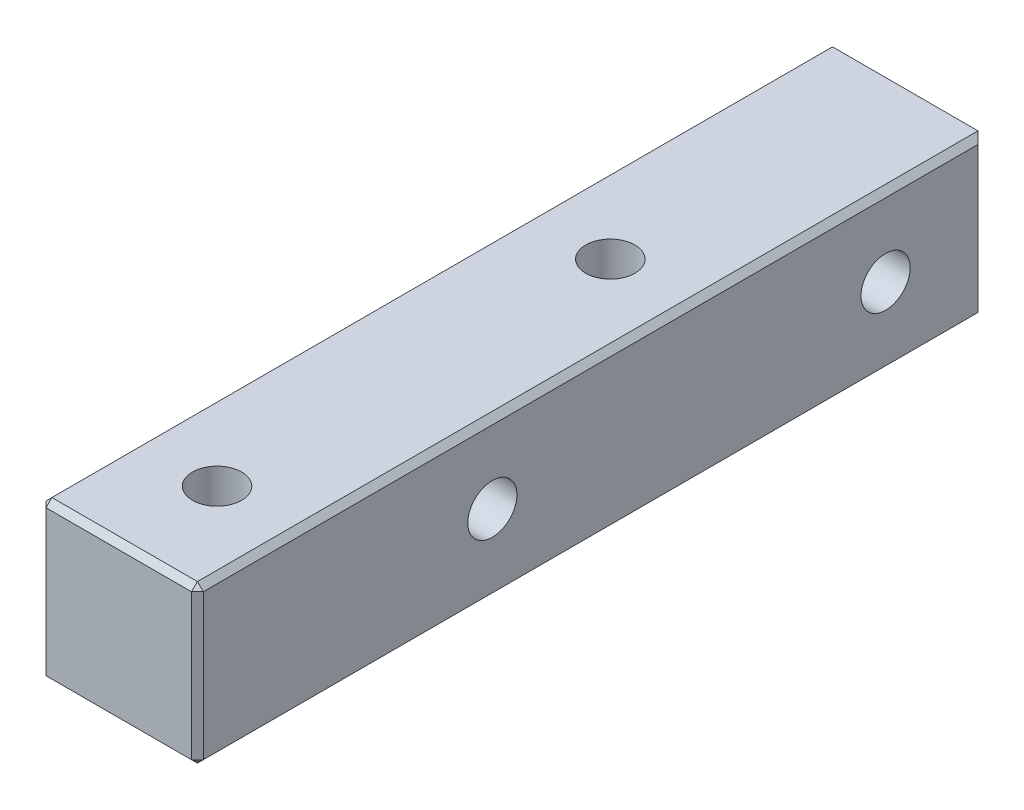
ISO-10303-21;
HEADER;
FILE_DESCRIPTION(('STEP AP214'),'2;1');
FILE_NAME('part.step','',(''),(''),'','','');
FILE_SCHEMA(('AUTOMOTIVE_DESIGN { 1 0 10303 214 1 1 1 1 }'));
ENDSEC;
DATA;
#1=APPLICATION_CONTEXT('core data for automotive mechanical design processes');
#2=APPLICATION_PROTOCOL_DEFINITION('international standard','automotive_design',2000,#1);
#3=PRODUCT_CONTEXT('',#1,'mechanical');
#4=PRODUCT('Part','Part','',(#3));
#5=PRODUCT_RELATED_PRODUCT_CATEGORY('part','',(#4));
#6=PRODUCT_DEFINITION_FORMATION('','',#4);
#7=PRODUCT_DEFINITION_CONTEXT('part definition',#1,'design');
#8=PRODUCT_DEFINITION('design','',#6,#7);
#9=PRODUCT_DEFINITION_SHAPE('','',#8);
#10=(LENGTH_UNIT() NAMED_UNIT(*) SI_UNIT(.MILLI.,.METRE.));
#11=(NAMED_UNIT(*) PLANE_ANGLE_UNIT() SI_UNIT($,.RADIAN.));
#12=(NAMED_UNIT(*) SI_UNIT($,.STERADIAN.) SOLID_ANGLE_UNIT());
#13=UNCERTAINTY_MEASURE_WITH_UNIT(LENGTH_MEASURE(1.E-05),#10,'distance_accuracy_value','');
#14=(GEOMETRIC_REPRESENTATION_CONTEXT(3) GLOBAL_UNCERTAINTY_ASSIGNED_CONTEXT((#13)) GLOBAL_UNIT_ASSIGNED_CONTEXT((#10,
#11,#12)) REPRESENTATION_CONTEXT('',''));
#15=CARTESIAN_POINT('',(0.,0.,0.));
#16=DIRECTION('',(0.,0.,1.));
#17=DIRECTION('',(1.,0.,0.));
#18=AXIS2_PLACEMENT_3D('',#15,#16,#17);
#19=CARTESIAN_POINT('',(-4.,4.,20.));
#20=DIRECTION('',(0.,-1.,0.));
#21=DIRECTION('',(1.,0.,0.));
#22=AXIS2_PLACEMENT_3D('',#19,#20,#21);
#23=PLANE('',#22);
#24=CARTESIAN_POINT('',(0.,4.,15.));
#25=DIRECTION('',(0.,1.,0.));
#26=DIRECTION('',(0.,0.,1.));
#27=AXIS2_PLACEMENT_3D('',#24,#25,#26);
#28=CIRCLE('',#27,1.24999999999999);
#29=CARTESIAN_POINT('',(0.,4.,16.25));
#30=VERTEX_POINT('',#29);
#31=EDGE_CURVE('E254',#30,#30,#28,.T.);
#32=ORIENTED_EDGE('',*,*,#31,.F.);
#33=EDGE_LOOP('',(#32));
#34=FACE_BOUND('',#33,.T.);
#35=DIRECTION('',(1.,0.,0.));
#36=VECTOR('',#35,1.);
#37=CARTESIAN_POINT('',(-4.,4.,19.7));
#38=LINE('',#37,#36);
#39=CARTESIAN_POINT('',(-3.7,4.,19.7));
#40=VERTEX_POINT('',#39);
#41=CARTESIAN_POINT('',(3.69999999999999,4.,19.7));
#42=VERTEX_POINT('',#41);
#43=EDGE_CURVE('E51',#40,#42,#38,.T.);
#44=ORIENTED_EDGE('',*,*,#43,.T.);
#45=DIRECTION('',(0.,0.,-1.));
#46=VECTOR('',#45,1.);
#47=CARTESIAN_POINT('',(3.69999999999999,4.,20.));
#48=LINE('',#47,#46);
#49=CARTESIAN_POINT('',(3.69999999999999,4.,-20.));
#50=VERTEX_POINT('',#49);
#51=EDGE_CURVE('E11',#42,#50,#48,.T.);
#52=ORIENTED_EDGE('',*,*,#51,.T.);
#53=DIRECTION('',(-1.,0.,0.));
#54=VECTOR('',#53,1.);
#55=CARTESIAN_POINT('',(-4.,4.,-20.));
#56=LINE('',#55,#54);
#57=CARTESIAN_POINT('',(-3.7,4.,-20.));
#58=VERTEX_POINT('',#57);
#59=EDGE_CURVE('E154',#50,#58,#56,.T.);
#60=ORIENTED_EDGE('',*,*,#59,.T.);
#61=DIRECTION('',(0.,0.,1.));
#62=VECTOR('',#61,1.);
#63=CARTESIAN_POINT('',(-3.7,4.,20.));
#64=LINE('',#63,#62);
#65=EDGE_CURVE('E62',#58,#40,#64,.T.);
#66=ORIENTED_EDGE('',*,*,#65,.T.);
#67=EDGE_LOOP('',(#44,#52,#60,#66));
#68=FACE_BOUND('',#67,.T.);
#69=CARTESIAN_POINT('',(0.,4.,-5.));
#70=DIRECTION('',(0.,1.,0.));
#71=DIRECTION('',(0.,0.,1.));
#72=AXIS2_PLACEMENT_3D('',#69,#70,#71);
#73=CIRCLE('',#72,1.24999999999999);
#74=CARTESIAN_POINT('',(0.,4.,-3.75000000000001));
#75=VERTEX_POINT('',#74);
#76=EDGE_CURVE('E243',#75,#75,#73,.T.);
#77=ORIENTED_EDGE('',*,*,#76,.F.);
#78=EDGE_LOOP('',(#77));
#79=FACE_BOUND('',#78,.T.);
#80=ADVANCED_FACE('F41',(#34,#68,#79),#23,.F.);
#81=CARTESIAN_POINT('',(-4.,-4.,20.));
#82=DIRECTION('',(1.,0.,0.));
#83=DIRECTION('',(0.,0.,-1.));
#84=AXIS2_PLACEMENT_3D('',#81,#82,#83);
#85=PLANE('',#84);
#86=DIRECTION('',(0.,-1.,0.));
#87=VECTOR('',#86,1.);
#88=CARTESIAN_POINT('',(-4.,-4.,-19.7));
#89=LINE('',#88,#87);
#90=CARTESIAN_POINT('',(-4.,3.69999999999999,-19.7));
#91=VERTEX_POINT('',#90);
#92=CARTESIAN_POINT('',(-4.,-3.69999999999999,-19.7));
#93=VERTEX_POINT('',#92);
#94=EDGE_CURVE('E169',#91,#93,#89,.T.);
#95=ORIENTED_EDGE('',*,*,#94,.T.);
#96=DIRECTION('',(0.,0.,1.));
#97=VECTOR('',#96,1.);
#98=CARTESIAN_POINT('',(-4.,-3.69999999999999,20.));
#99=LINE('',#98,#97);
#100=CARTESIAN_POINT('',(-4.,-3.69999999999999,19.7));
#101=VERTEX_POINT('',#100);
#102=EDGE_CURVE('E131',#93,#101,#99,.T.);
#103=ORIENTED_EDGE('',*,*,#102,.T.);
#104=DIRECTION('',(0.,1.,0.));
#105=VECTOR('',#104,1.);
#106=CARTESIAN_POINT('',(-4.,-4.,19.7));
#107=LINE('',#106,#105);
#108=CARTESIAN_POINT('',(-4.,3.69999999999999,19.7));
#109=VERTEX_POINT('',#108);
#110=EDGE_CURVE('E167',#101,#109,#107,.T.);
#111=ORIENTED_EDGE('',*,*,#110,.T.);
#112=DIRECTION('',(0.,0.,-1.));
#113=VECTOR('',#112,1.);
#114=CARTESIAN_POINT('',(-4.,3.69999999999999,20.));
#115=LINE('',#114,#113);
#116=EDGE_CURVE('E162',#109,#91,#115,.T.);
#117=ORIENTED_EDGE('',*,*,#116,.T.);
#118=EDGE_LOOP('',(#95,#103,#111,#117));
#119=FACE_BOUND('',#118,.T.);
#120=CARTESIAN_POINT('',(-4.,0.,-15.));
#121=DIRECTION('',(-1.,0.,0.));
#122=DIRECTION('',(0.,0.,1.));
#123=AXIS2_PLACEMENT_3D('',#120,#121,#122);
#124=CIRCLE('',#123,1.24999999999999);
#125=CARTESIAN_POINT('',(-4.,0.,-13.75));
#126=VERTEX_POINT('',#125);
#127=EDGE_CURVE('E262',#126,#126,#124,.T.);
#128=ORIENTED_EDGE('',*,*,#127,.F.);
#129=EDGE_LOOP('',(#128));
#130=FACE_BOUND('',#129,.T.);
#131=CARTESIAN_POINT('',(-4.,0.,5.));
#132=DIRECTION('',(-1.,0.,0.));
#133=DIRECTION('',(0.,0.,1.));
#134=AXIS2_PLACEMENT_3D('',#131,#132,#133);
#135=CIRCLE('',#134,1.24999999999999);
#136=CARTESIAN_POINT('',(-4.,0.,6.24999999999999));
#137=VERTEX_POINT('',#136);
#138=EDGE_CURVE('E268',#137,#137,#135,.T.);
#139=ORIENTED_EDGE('',*,*,#138,.F.);
#140=EDGE_LOOP('',(#139));
#141=FACE_BOUND('',#140,.T.);
#142=ADVANCED_FACE('F287',(#119,#130,#141),#85,.F.);
#143=CARTESIAN_POINT('',(4.,-4.,20.));
#144=DIRECTION('',(-1.,0.,0.));
#145=DIRECTION('',(0.,-1.,0.));
#146=AXIS2_PLACEMENT_3D('',#143,#144,#145);
#147=PLANE('',#146);
#148=DIRECTION('',(0.,0.,1.));
#149=VECTOR('',#148,1.);
#150=CARTESIAN_POINT('',(4.,3.7,20.));
#151=LINE('',#150,#149);
#152=CARTESIAN_POINT('',(4.,3.7,-19.7));
#153=VERTEX_POINT('',#152);
#154=CARTESIAN_POINT('',(4.,3.7,19.7));
#155=VERTEX_POINT('',#154);
#156=EDGE_CURVE('E181',#153,#155,#151,.T.);
#157=ORIENTED_EDGE('',*,*,#156,.T.);
#158=DIRECTION('',(0.,-1.,0.));
#159=VECTOR('',#158,1.);
#160=CARTESIAN_POINT('',(4.,-4.,19.7));
#161=LINE('',#160,#159);
#162=CARTESIAN_POINT('',(4.,-3.69999999999999,19.7));
#163=VERTEX_POINT('',#162);
#164=EDGE_CURVE('E187',#155,#163,#161,.T.);
#165=ORIENTED_EDGE('',*,*,#164,.T.);
#166=DIRECTION('',(0.,0.,-1.));
#167=VECTOR('',#166,1.);
#168=CARTESIAN_POINT('',(4.,-3.69999999999999,20.));
#169=LINE('',#168,#167);
#170=CARTESIAN_POINT('',(4.,-3.69999999999999,-19.7));
#171=VERTEX_POINT('',#170);
#172=EDGE_CURVE('E185',#163,#171,#169,.T.);
#173=ORIENTED_EDGE('',*,*,#172,.T.);
#174=DIRECTION('',(0.,1.,0.));
#175=VECTOR('',#174,1.);
#176=CARTESIAN_POINT('',(4.,4.,-19.7));
#177=LINE('',#176,#175);
#178=EDGE_CURVE('E183',#171,#153,#177,.T.);
#179=ORIENTED_EDGE('',*,*,#178,.T.);
#180=EDGE_LOOP('',(#157,#165,#173,#179));
#181=FACE_BOUND('',#180,.T.);
#182=CARTESIAN_POINT('',(4.,0.,-15.));
#183=DIRECTION('',(-1.,0.,0.));
#184=DIRECTION('',(0.,-1.,0.));
#185=AXIS2_PLACEMENT_3D('',#182,#183,#184);
#186=CIRCLE('',#185,1.24999999999999);
#187=CARTESIAN_POINT('',(4.,-1.24999999999999,-15.));
#188=VERTEX_POINT('',#187);
#189=EDGE_CURVE('E265',#188,#188,#186,.T.);
#190=ORIENTED_EDGE('',*,*,#189,.T.);
#191=EDGE_LOOP('',(#190));
#192=FACE_BOUND('',#191,.T.);
#193=CARTESIAN_POINT('',(4.,0.,5.));
#194=DIRECTION('',(-1.,0.,0.));
#195=DIRECTION('',(0.,-1.,0.));
#196=AXIS2_PLACEMENT_3D('',#193,#194,#195);
#197=CIRCLE('',#196,1.24999999999999);
#198=CARTESIAN_POINT('',(4.,-1.24999999999999,5.));
#199=VERTEX_POINT('',#198);
#200=EDGE_CURVE('E271',#199,#199,#197,.T.);
#201=ORIENTED_EDGE('',*,*,#200,.T.);
#202=EDGE_LOOP('',(#201));
#203=FACE_BOUND('',#202,.T.);
#204=ADVANCED_FACE('F329',(#181,#192,#203),#147,.F.);
#205=CARTESIAN_POINT('',(-4.,-4.,20.));
#206=DIRECTION('',(0.,1.,0.));
#207=DIRECTION('',(0.,0.,1.));
#208=AXIS2_PLACEMENT_3D('',#205,#206,#207);
#209=PLANE('',#208);
#210=DIRECTION('',(0.,0.,1.));
#211=VECTOR('',#210,1.);
#212=CARTESIAN_POINT('',(3.69999999999999,-4.,20.));
#213=LINE('',#212,#211);
#214=CARTESIAN_POINT('',(3.69999999999999,-4.,-19.7));
#215=VERTEX_POINT('',#214);
#216=CARTESIAN_POINT('',(3.69999999999999,-4.,19.7));
#217=VERTEX_POINT('',#216);
#218=EDGE_CURVE('E153',#215,#217,#213,.T.);
#219=ORIENTED_EDGE('',*,*,#218,.T.);
#220=DIRECTION('',(-1.,0.,0.));
#221=VECTOR('',#220,1.);
#222=CARTESIAN_POINT('',(-4.,-4.,19.7));
#223=LINE('',#222,#221);
#224=CARTESIAN_POINT('',(-3.7,-4.,19.7));
#225=VERTEX_POINT('',#224);
#226=EDGE_CURVE('E159',#217,#225,#223,.T.);
#227=ORIENTED_EDGE('',*,*,#226,.T.);
#228=DIRECTION('',(0.,0.,-1.));
#229=VECTOR('',#228,1.);
#230=CARTESIAN_POINT('',(-3.7,-4.,20.));
#231=LINE('',#230,#229);
#232=CARTESIAN_POINT('',(-3.7,-4.,-19.7));
#233=VERTEX_POINT('',#232);
#234=EDGE_CURVE('E129',#225,#233,#231,.T.);
#235=ORIENTED_EDGE('',*,*,#234,.T.);
#236=DIRECTION('',(1.,0.,0.));
#237=VECTOR('',#236,1.);
#238=CARTESIAN_POINT('',(4.,-4.,-19.7));
#239=LINE('',#238,#237);
#240=EDGE_CURVE('E147',#233,#215,#239,.T.);
#241=ORIENTED_EDGE('',*,*,#240,.T.);
#242=EDGE_LOOP('',(#219,#227,#235,#241));
#243=FACE_BOUND('',#242,.T.);
#244=CARTESIAN_POINT('',(0.,-4.,-5.));
#245=DIRECTION('',(0.,1.,0.));
#246=DIRECTION('',(0.,0.,1.));
#247=AXIS2_PLACEMENT_3D('',#244,#245,#246);
#248=CIRCLE('',#247,1.24999999999999);
#249=CARTESIAN_POINT('',(0.,-4.,-3.75000000000001));
#250=VERTEX_POINT('',#249);
#251=EDGE_CURVE('E249',#250,#250,#248,.T.);
#252=ORIENTED_EDGE('',*,*,#251,.T.);
#253=EDGE_LOOP('',(#252));
#254=FACE_BOUND('',#253,.T.);
#255=CARTESIAN_POINT('',(0.,-4.,15.));
#256=DIRECTION('',(0.,1.,0.));
#257=DIRECTION('',(0.,0.,1.));
#258=AXIS2_PLACEMENT_3D('',#255,#256,#257);
#259=CIRCLE('',#258,1.24999999999999);
#260=CARTESIAN_POINT('',(0.,-4.,16.25));
#261=VERTEX_POINT('',#260);
#262=EDGE_CURVE('E259',#261,#261,#259,.T.);
#263=ORIENTED_EDGE('',*,*,#262,.T.);
#264=EDGE_LOOP('',(#263));
#265=FACE_BOUND('',#264,.T.);
#266=ADVANCED_FACE('F156',(#243,#254,#265),#209,.F.);
#267=CARTESIAN_POINT('',(0.,0.,20.));
#268=DIRECTION('',(0.,0.,-1.));
#269=DIRECTION('',(-1.,0.,0.));
#270=AXIS2_PLACEMENT_3D('',#267,#268,#269);
#271=PLANE('',#270);
#272=DIRECTION('',(1.,0.,0.));
#273=VECTOR('',#272,1.);
#274=CARTESIAN_POINT('',(0.,-3.69999999999999,20.));
#275=LINE('',#274,#273);
#276=CARTESIAN_POINT('',(-3.7,-3.69999999999999,20.));
#277=VERTEX_POINT('',#276);
#278=CARTESIAN_POINT('',(3.69999999999999,-3.69999999999999,20.));
#279=VERTEX_POINT('',#278);
#280=EDGE_CURVE('E176',#277,#279,#275,.T.);
#281=ORIENTED_EDGE('',*,*,#280,.T.);
#282=DIRECTION('',(0.,1.,0.));
#283=VECTOR('',#282,1.);
#284=CARTESIAN_POINT('',(3.69999999999999,0.,20.));
#285=LINE('',#284,#283);
#286=CARTESIAN_POINT('',(3.69999999999999,3.7,20.));
#287=VERTEX_POINT('',#286);
#288=EDGE_CURVE('E178',#279,#287,#285,.T.);
#289=ORIENTED_EDGE('',*,*,#288,.T.);
#290=DIRECTION('',(-1.,0.,0.));
#291=VECTOR('',#290,1.);
#292=CARTESIAN_POINT('',(0.,3.69999999999999,20.));
#293=LINE('',#292,#291);
#294=CARTESIAN_POINT('',(-3.7,3.69999999999999,20.));
#295=VERTEX_POINT('',#294);
#296=EDGE_CURVE('E174',#287,#295,#293,.T.);
#297=ORIENTED_EDGE('',*,*,#296,.T.);
#298=DIRECTION('',(0.,-1.,0.));
#299=VECTOR('',#298,1.);
#300=CARTESIAN_POINT('',(-3.7,0.,20.));
#301=LINE('',#300,#299);
#302=EDGE_CURVE('E172',#295,#277,#301,.T.);
#303=ORIENTED_EDGE('',*,*,#302,.T.);
#304=EDGE_LOOP('',(#281,#289,#297,#303));
#305=FACE_BOUND('',#304,.T.);
#306=ADVANCED_FACE('F306',(#305),#271,.F.);
#307=CARTESIAN_POINT('',(0.,0.,-20.));
#308=DIRECTION('',(0.,0.,-1.));
#309=DIRECTION('',(-1.,0.,0.));
#310=AXIS2_PLACEMENT_3D('',#307,#308,#309);
#311=PLANE('',#310);
#312=DIRECTION('',(-1.,0.,0.));
#313=VECTOR('',#312,1.);
#314=CARTESIAN_POINT('',(-4.,-3.69999999999999,-20.));
#315=LINE('',#314,#313);
#316=CARTESIAN_POINT('',(3.69999999999999,-3.69999999999999,-20.));
#317=VERTEX_POINT('',#316);
#318=CARTESIAN_POINT('',(-3.7,-3.69999999999999,-20.));
#319=VERTEX_POINT('',#318);
#320=EDGE_CURVE('E192',#317,#319,#315,.T.);
#321=ORIENTED_EDGE('',*,*,#320,.T.);
#322=DIRECTION('',(0.,1.,0.));
#323=VECTOR('',#322,1.);
#324=CARTESIAN_POINT('',(-3.7,4.,-20.));
#325=LINE('',#324,#323);
#326=EDGE_CURVE('E195',#319,#58,#325,.T.);
#327=ORIENTED_EDGE('',*,*,#326,.T.);
#328=ORIENTED_EDGE('',*,*,#59,.F.);
#329=DIRECTION('',(0.,-1.,0.));
#330=VECTOR('',#329,1.);
#331=CARTESIAN_POINT('',(3.69999999999999,-4.,-20.));
#332=LINE('',#331,#330);
#333=EDGE_CURVE('E190',#50,#317,#332,.T.);
#334=ORIENTED_EDGE('',*,*,#333,.T.);
#335=EDGE_LOOP('',(#321,#327,#328,#334));
#336=FACE_BOUND('',#335,.T.);
#337=ADVANCED_FACE('F429',(#336),#311,.T.);
#338=CARTESIAN_POINT('',(-4.,0.,5.));
#339=DIRECTION('',(-1.,0.,0.));
#340=DIRECTION('',(0.,0.,1.));
#341=AXIS2_PLACEMENT_3D('',#338,#339,#340);
#342=CYLINDRICAL_SURFACE('',#341,1.24999999999999);
#343=ORIENTED_EDGE('',*,*,#200,.F.);
#344=EDGE_LOOP('',(#343));
#345=FACE_BOUND('',#344,.T.);
#346=ORIENTED_EDGE('',*,*,#138,.T.);
#347=EDGE_LOOP('',(#346));
#348=FACE_BOUND('',#347,.T.);
#349=ADVANCED_FACE('F425',(#345,#348),#342,.F.);
#350=CARTESIAN_POINT('',(-4.,0.,-15.));
#351=DIRECTION('',(-1.,0.,0.));
#352=DIRECTION('',(0.,0.,1.));
#353=AXIS2_PLACEMENT_3D('',#350,#351,#352);
#354=CYLINDRICAL_SURFACE('',#353,1.24999999999999);
#355=ORIENTED_EDGE('',*,*,#189,.F.);
#356=EDGE_LOOP('',(#355));
#357=FACE_BOUND('',#356,.T.);
#358=ORIENTED_EDGE('',*,*,#127,.T.);
#359=EDGE_LOOP('',(#358));
#360=FACE_BOUND('',#359,.T.);
#361=ADVANCED_FACE('F418',(#357,#360),#354,.F.);
#362=CARTESIAN_POINT('',(0.,4.,15.));
#363=DIRECTION('',(0.,1.,0.));
#364=DIRECTION('',(0.,0.,1.));
#365=AXIS2_PLACEMENT_3D('',#362,#363,#364);
#366=CYLINDRICAL_SURFACE('',#365,1.24999999999999);
#367=ORIENTED_EDGE('',*,*,#262,.F.);
#368=EDGE_LOOP('',(#367));
#369=FACE_BOUND('',#368,.T.);
#370=ORIENTED_EDGE('',*,*,#31,.T.);
#371=EDGE_LOOP('',(#370));
#372=FACE_BOUND('',#371,.T.);
#373=ADVANCED_FACE('F412',(#369,#372),#366,.F.);
#374=CARTESIAN_POINT('',(0.,4.,-5.));
#375=DIRECTION('',(0.,1.,0.));
#376=DIRECTION('',(0.,0.,1.));
#377=AXIS2_PLACEMENT_3D('',#374,#375,#376);
#378=CYLINDRICAL_SURFACE('',#377,1.24999999999999);
#379=ORIENTED_EDGE('',*,*,#251,.F.);
#380=EDGE_LOOP('',(#379));
#381=FACE_BOUND('',#380,.T.);
#382=ORIENTED_EDGE('',*,*,#76,.T.);
#383=EDGE_LOOP('',(#382));
#384=FACE_BOUND('',#383,.T.);
#385=ADVANCED_FACE('F408',(#381,#384),#378,.F.);
#386=CARTESIAN_POINT('',(3.69999999999999,3.7,20.));
#387=DIRECTION('',(0.577350269189626,0.577350269189626,0.577350269189626));
#388=DIRECTION('',(0.707106781186548,0.,-0.707106781186548));
#389=AXIS2_PLACEMENT_3D('',#386,#387,#388);
#390=PLANE('',#389);
#391=DIRECTION('',(-0.707106781186547,0.,0.707106781186547));
#392=VECTOR('',#391,1.);
#393=CARTESIAN_POINT('',(3.69999999999999,3.7,20.));
#394=LINE('',#393,#392);
#395=EDGE_CURVE('E236',#155,#287,#394,.T.);
#396=ORIENTED_EDGE('',*,*,#395,.F.);
#397=DIRECTION('',(0.707106781186548,-0.707106781186548,0.));
#398=VECTOR('',#397,1.);
#399=CARTESIAN_POINT('',(3.85,3.85,19.7));
#400=LINE('',#399,#398);
#401=EDGE_CURVE('E46',#42,#155,#400,.T.);
#402=ORIENTED_EDGE('',*,*,#401,.F.);
#403=DIRECTION('',(0.,0.707106781186547,-0.707106781186547));
#404=VECTOR('',#403,1.);
#405=CARTESIAN_POINT('',(3.69999999999999,3.7,20.));
#406=LINE('',#405,#404);
#407=EDGE_CURVE('E238',#287,#42,#406,.T.);
#408=ORIENTED_EDGE('',*,*,#407,.F.);
#409=EDGE_LOOP('',(#396,#402,#408));
#410=FACE_BOUND('',#409,.T.);
#411=ADVANCED_FACE('F44',(#410),#390,.T.);
#412=CARTESIAN_POINT('',(3.69999999999999,4.,20.));
#413=DIRECTION('',(-0.707106781186547,-0.707106781186547,0.));
#414=DIRECTION('',(0.,0.,-1.));
#415=AXIS2_PLACEMENT_3D('',#412,#413,#414);
#416=PLANE('',#415);
#417=ORIENTED_EDGE('',*,*,#401,.T.);
#418=ORIENTED_EDGE('',*,*,#156,.F.);
#419=DIRECTION('',(0.577350269189628,-0.577350269189628,0.577350269189621));
#420=VECTOR('',#419,1.);
#421=CARTESIAN_POINT('',(17.0333333333333,-9.33333333333328,-6.66666666666688));
#422=LINE('',#421,#420);
#423=EDGE_CURVE('E233',#50,#153,#422,.T.);
#424=ORIENTED_EDGE('',*,*,#423,.F.);
#425=ORIENTED_EDGE('',*,*,#51,.F.);
#426=EDGE_LOOP('',(#417,#418,#424,#425));
#427=FACE_BOUND('',#426,.T.);
#428=ADVANCED_FACE('F400',(#427),#416,.F.);
#429=CARTESIAN_POINT('',(0.,3.69999999999999,20.));
#430=DIRECTION('',(0.,-0.707106781186547,-0.707106781186547));
#431=DIRECTION('',(-1.,0.,0.));
#432=AXIS2_PLACEMENT_3D('',#429,#430,#431);
#433=PLANE('',#432);
#434=ORIENTED_EDGE('',*,*,#407,.T.);
#435=ORIENTED_EDGE('',*,*,#43,.F.);
#436=DIRECTION('',(0.,-0.707106781186547,0.707106781186547));
#437=VECTOR('',#436,1.);
#438=CARTESIAN_POINT('',(-3.7,3.69999999999999,20.));
#439=LINE('',#438,#437);
#440=EDGE_CURVE('E230',#295,#40,#439,.F.);
#441=ORIENTED_EDGE('',*,*,#440,.F.);
#442=ORIENTED_EDGE('',*,*,#296,.F.);
#443=EDGE_LOOP('',(#434,#435,#441,#442));
#444=FACE_BOUND('',#443,.T.);
#445=ADVANCED_FACE('F298',(#444),#433,.F.);
#446=CARTESIAN_POINT('',(3.69999999999999,0.,20.));
#447=DIRECTION('',(-0.707106781186547,0.,-0.707106781186547));
#448=DIRECTION('',(0.,1.,0.));
#449=AXIS2_PLACEMENT_3D('',#446,#447,#448);
#450=PLANE('',#449);
#451=ORIENTED_EDGE('',*,*,#395,.T.);
#452=ORIENTED_EDGE('',*,*,#288,.F.);
#453=DIRECTION('',(0.707106781186547,0.,-0.707106781186547));
#454=VECTOR('',#453,1.);
#455=CARTESIAN_POINT('',(4.,-3.69999999999999,19.7));
#456=LINE('',#455,#454);
#457=EDGE_CURVE('E227',#163,#279,#456,.F.);
#458=ORIENTED_EDGE('',*,*,#457,.F.);
#459=ORIENTED_EDGE('',*,*,#164,.F.);
#460=EDGE_LOOP('',(#451,#452,#458,#459));
#461=FACE_BOUND('',#460,.T.);
#462=ADVANCED_FACE('F304',(#461),#450,.F.);
#463=CARTESIAN_POINT('',(4.,-3.69999999999999,20.));
#464=DIRECTION('',(-0.707106781186547,0.707106781186547,0.));
#465=DIRECTION('',(0.,0.,-1.));
#466=AXIS2_PLACEMENT_3D('',#463,#464,#465);
#467=PLANE('',#466);
#468=DIRECTION('',(0.707106781186548,0.707106781186548,0.));
#469=VECTOR('',#468,1.);
#470=CARTESIAN_POINT('',(4.,-3.69999999999999,-19.7));
#471=LINE('',#470,#469);
#472=EDGE_CURVE('E222',#171,#215,#471,.F.);
#473=ORIENTED_EDGE('',*,*,#472,.F.);
#474=ORIENTED_EDGE('',*,*,#172,.F.);
#475=DIRECTION('',(-0.707106781186548,-0.707106781186548,0.));
#476=VECTOR('',#475,1.);
#477=CARTESIAN_POINT('',(4.,-3.69999999999999,19.7));
#478=LINE('',#477,#476);
#479=EDGE_CURVE('E225',#217,#163,#478,.F.);
#480=ORIENTED_EDGE('',*,*,#479,.F.);
#481=ORIENTED_EDGE('',*,*,#218,.F.);
#482=EDGE_LOOP('',(#473,#474,#480,#481));
#483=FACE_BOUND('',#482,.T.);
#484=ADVANCED_FACE('F389',(#483),#467,.F.);
#485=CARTESIAN_POINT('',(4.,-4.,-19.7));
#486=DIRECTION('',(0.707106781186544,0.,-0.707106781186552));
#487=DIRECTION('',(0.,-1.,0.));
#488=AXIS2_PLACEMENT_3D('',#485,#486,#487);
#489=PLANE('',#488);
#490=ORIENTED_EDGE('',*,*,#423,.T.);
#491=ORIENTED_EDGE('',*,*,#178,.F.);
#492=DIRECTION('',(0.707106781186552,0.,0.707106781186543));
#493=VECTOR('',#492,1.);
#494=CARTESIAN_POINT('',(4.,-3.69999999999999,-19.7));
#495=LINE('',#494,#493);
#496=EDGE_CURVE('E219',#317,#171,#495,.T.);
#497=ORIENTED_EDGE('',*,*,#496,.F.);
#498=ORIENTED_EDGE('',*,*,#333,.F.);
#499=EDGE_LOOP('',(#490,#491,#497,#498));
#500=FACE_BOUND('',#499,.T.);
#501=ADVANCED_FACE('F384',(#500),#489,.T.);
#502=CARTESIAN_POINT('',(-3.7,3.69999999999999,20.));
#503=DIRECTION('',(-0.577350269189626,0.577350269189626,0.577350269189626));
#504=DIRECTION('',(0.707106781186548,0.,0.707106781186548));
#505=AXIS2_PLACEMENT_3D('',#502,#503,#504);
#506=PLANE('',#505);
#507=DIRECTION('',(-0.707106781186548,0.,-0.707106781186548));
#508=VECTOR('',#507,1.);
#509=CARTESIAN_POINT('',(-3.7,3.69999999999999,20.));
#510=LINE('',#509,#508);
#511=EDGE_CURVE('E213',#295,#109,#510,.T.);
#512=ORIENTED_EDGE('',*,*,#511,.F.);
#513=ORIENTED_EDGE('',*,*,#440,.T.);
#514=DIRECTION('',(0.707106781186548,0.707106781186548,0.));
#515=VECTOR('',#514,1.);
#516=CARTESIAN_POINT('',(-3.85,3.85,19.7));
#517=LINE('',#516,#515);
#518=EDGE_CURVE('E216',#109,#40,#517,.T.);
#519=ORIENTED_EDGE('',*,*,#518,.F.);
#520=EDGE_LOOP('',(#512,#513,#519));
#521=FACE_BOUND('',#520,.T.);
#522=ADVANCED_FACE('F296',(#521),#506,.T.);
#523=CARTESIAN_POINT('',(4.,-3.69999999999999,19.7));
#524=DIRECTION('',(0.577350269189626,-0.577350269189626,0.577350269189626));
#525=DIRECTION('',(0.707106781186548,0.,-0.707106781186548));
#526=AXIS2_PLACEMENT_3D('',#523,#524,#525);
#527=PLANE('',#526);
#528=ORIENTED_EDGE('',*,*,#479,.T.);
#529=ORIENTED_EDGE('',*,*,#457,.T.);
#530=DIRECTION('',(0.,0.707106781186548,0.707106781186548));
#531=VECTOR('',#530,1.);
#532=CARTESIAN_POINT('',(3.69999999999999,-3.85,19.85));
#533=LINE('',#532,#531);
#534=EDGE_CURVE('E210',#217,#279,#533,.T.);
#535=ORIENTED_EDGE('',*,*,#534,.F.);
#536=EDGE_LOOP('',(#528,#529,#535));
#537=FACE_BOUND('',#536,.T.);
#538=ADVANCED_FACE('F375',(#537),#527,.T.);
#539=CARTESIAN_POINT('',(4.,-3.69999999999999,-19.7));
#540=DIRECTION('',(0.577350269189624,-0.577350269189624,-0.57735026918963));
#541=DIRECTION('',(-0.707106781186552,0.,-0.707106781186543));
#542=AXIS2_PLACEMENT_3D('',#539,#540,#541);
#543=PLANE('',#542);
#544=ORIENTED_EDGE('',*,*,#496,.T.);
#545=ORIENTED_EDGE('',*,*,#472,.T.);
#546=DIRECTION('',(0.,0.707106781186552,-0.707106781186543));
#547=VECTOR('',#546,1.);
#548=CARTESIAN_POINT('',(3.69999999999999,-3.84999999999999,-19.85));
#549=LINE('',#548,#547);
#550=EDGE_CURVE('E150',#317,#215,#549,.F.);
#551=ORIENTED_EDGE('',*,*,#550,.F.);
#552=EDGE_LOOP('',(#544,#545,#551));
#553=FACE_BOUND('',#552,.T.);
#554=ADVANCED_FACE('F370',(#553),#543,.T.);
#555=CARTESIAN_POINT('',(-4.,3.69999999999999,20.));
#556=DIRECTION('',(0.707106781186547,-0.707106781186547,0.));
#557=DIRECTION('',(0.,0.,-1.));
#558=AXIS2_PLACEMENT_3D('',#555,#556,#557);
#559=PLANE('',#558);
#560=ORIENTED_EDGE('',*,*,#518,.T.);
#561=ORIENTED_EDGE('',*,*,#65,.F.);
#562=DIRECTION('',(0.577350269189628,0.577350269189628,-0.577350269189622));
#563=VECTOR('',#562,1.);
#564=CARTESIAN_POINT('',(-17.2333333333333,-9.53333333333329,-6.46666666666687));
#565=LINE('',#564,#563);
#566=EDGE_CURVE('E206',#91,#58,#565,.T.);
#567=ORIENTED_EDGE('',*,*,#566,.F.);
#568=ORIENTED_EDGE('',*,*,#116,.F.);
#569=EDGE_LOOP('',(#560,#561,#567,#568));
#570=FACE_BOUND('',#569,.T.);
#571=ADVANCED_FACE('F280',(#570),#559,.F.);
#572=CARTESIAN_POINT('',(-3.7,0.,20.));
#573=DIRECTION('',(0.707106781186547,0.,-0.707106781186547));
#574=DIRECTION('',(0.,-1.,0.));
#575=AXIS2_PLACEMENT_3D('',#572,#573,#574);
#576=PLANE('',#575);
#577=ORIENTED_EDGE('',*,*,#511,.T.);
#578=ORIENTED_EDGE('',*,*,#110,.F.);
#579=DIRECTION('',(0.707106781186548,0.,0.707106781186548));
#580=VECTOR('',#579,1.);
#581=CARTESIAN_POINT('',(-4.,-3.69999999999999,19.7));
#582=LINE('',#581,#580);
#583=EDGE_CURVE('E203',#277,#101,#582,.F.);
#584=ORIENTED_EDGE('',*,*,#583,.F.);
#585=ORIENTED_EDGE('',*,*,#302,.F.);
#586=EDGE_LOOP('',(#577,#578,#584,#585));
#587=FACE_BOUND('',#586,.T.);
#588=ADVANCED_FACE('F294',(#587),#576,.F.);
#589=CARTESIAN_POINT('',(0.,-3.69999999999999,20.));
#590=DIRECTION('',(0.,0.707106781186547,-0.707106781186547));
#591=DIRECTION('',(1.,0.,0.));
#592=AXIS2_PLACEMENT_3D('',#589,#590,#591);
#593=PLANE('',#592);
#594=ORIENTED_EDGE('',*,*,#534,.T.);
#595=ORIENTED_EDGE('',*,*,#280,.F.);
#596=DIRECTION('',(0.,-0.707106781186548,-0.707106781186548));
#597=VECTOR('',#596,1.);
#598=CARTESIAN_POINT('',(-3.7,-3.85,19.85));
#599=LINE('',#598,#597);
#600=EDGE_CURVE('E144',#225,#277,#599,.F.);
#601=ORIENTED_EDGE('',*,*,#600,.F.);
#602=ORIENTED_EDGE('',*,*,#226,.F.);
#603=EDGE_LOOP('',(#594,#595,#601,#602));
#604=FACE_BOUND('',#603,.T.);
#605=ADVANCED_FACE('F309',(#604),#593,.F.);
#606=CARTESIAN_POINT('',(-4.,-4.,-19.7));
#607=DIRECTION('',(0.,-0.707106781186544,-0.707106781186552));
#608=DIRECTION('',(-1.,0.,0.));
#609=AXIS2_PLACEMENT_3D('',#606,#607,#608);
#610=PLANE('',#609);
#611=ORIENTED_EDGE('',*,*,#550,.T.);
#612=ORIENTED_EDGE('',*,*,#240,.F.);
#613=DIRECTION('',(0.,-0.707106781186552,0.707106781186543));
#614=VECTOR('',#613,1.);
#615=CARTESIAN_POINT('',(-3.7,-4.,-19.7));
#616=LINE('',#615,#614);
#617=EDGE_CURVE('E136',#319,#233,#616,.T.);
#618=ORIENTED_EDGE('',*,*,#617,.F.);
#619=ORIENTED_EDGE('',*,*,#320,.F.);
#620=EDGE_LOOP('',(#611,#612,#618,#619));
#621=FACE_BOUND('',#620,.T.);
#622=ADVANCED_FACE('F148',(#621),#610,.T.);
#623=CARTESIAN_POINT('',(-4.,-4.,-19.7));
#624=DIRECTION('',(-0.707106781186544,0.,-0.707106781186552));
#625=DIRECTION('',(0.,1.,0.));
#626=AXIS2_PLACEMENT_3D('',#623,#624,#625);
#627=PLANE('',#626);
#628=ORIENTED_EDGE('',*,*,#566,.T.);
#629=ORIENTED_EDGE('',*,*,#326,.F.);
#630=DIRECTION('',(0.707106781186552,0.,-0.707106781186543));
#631=VECTOR('',#630,1.);
#632=CARTESIAN_POINT('',(-3.85,-3.69999999999999,-19.85));
#633=LINE('',#632,#631);
#634=EDGE_CURVE('E140',#93,#319,#633,.T.);
#635=ORIENTED_EDGE('',*,*,#634,.F.);
#636=ORIENTED_EDGE('',*,*,#94,.F.);
#637=EDGE_LOOP('',(#628,#629,#635,#636));
#638=FACE_BOUND('',#637,.T.);
#639=ADVANCED_FACE('F285',(#638),#627,.T.);
#640=CARTESIAN_POINT('',(-4.,-3.69999999999999,19.7));
#641=DIRECTION('',(-0.577350269189626,-0.577350269189626,0.577350269189626));
#642=DIRECTION('',(0.707106781186548,0.,0.707106781186548));
#643=AXIS2_PLACEMENT_3D('',#640,#641,#642);
#644=PLANE('',#643);
#645=ORIENTED_EDGE('',*,*,#600,.T.);
#646=ORIENTED_EDGE('',*,*,#583,.T.);
#647=DIRECTION('',(-0.707106781186548,0.707106781186548,0.));
#648=VECTOR('',#647,1.);
#649=CARTESIAN_POINT('',(-4.,-3.69999999999999,19.7));
#650=LINE('',#649,#648);
#651=EDGE_CURVE('E133',#225,#101,#650,.T.);
#652=ORIENTED_EDGE('',*,*,#651,.F.);
#653=EDGE_LOOP('',(#645,#646,#652));
#654=FACE_BOUND('',#653,.T.);
#655=ADVANCED_FACE('F313',(#654),#644,.T.);
#656=CARTESIAN_POINT('',(-3.7,-4.,-19.7));
#657=DIRECTION('',(-0.577350269189624,-0.577350269189624,-0.57735026918963));
#658=DIRECTION('',(-0.707106781186552,0.,0.707106781186543));
#659=AXIS2_PLACEMENT_3D('',#656,#657,#658);
#660=PLANE('',#659);
#661=ORIENTED_EDGE('',*,*,#634,.T.);
#662=ORIENTED_EDGE('',*,*,#617,.T.);
#663=DIRECTION('',(0.707106781186548,-0.707106781186548,0.));
#664=VECTOR('',#663,1.);
#665=CARTESIAN_POINT('',(-3.7,-4.,-19.7));
#666=LINE('',#665,#664);
#667=EDGE_CURVE('E125',#93,#233,#666,.T.);
#668=ORIENTED_EDGE('',*,*,#667,.F.);
#669=EDGE_LOOP('',(#661,#662,#668));
#670=FACE_BOUND('',#669,.T.);
#671=ADVANCED_FACE('F138',(#670),#660,.T.);
#672=CARTESIAN_POINT('',(-3.7,-4.,20.));
#673=DIRECTION('',(0.707106781186547,0.707106781186547,0.));
#674=DIRECTION('',(0.,0.,-1.));
#675=AXIS2_PLACEMENT_3D('',#672,#673,#674);
#676=PLANE('',#675);
#677=ORIENTED_EDGE('',*,*,#651,.T.);
#678=ORIENTED_EDGE('',*,*,#102,.F.);
#679=ORIENTED_EDGE('',*,*,#667,.T.);
#680=ORIENTED_EDGE('',*,*,#234,.F.);
#681=EDGE_LOOP('',(#677,#678,#679,#680));
#682=FACE_BOUND('',#681,.T.);
#683=ADVANCED_FACE('F127',(#682),#676,.F.);
#684=CLOSED_SHELL('',(#80,#142,#204,#266,#306,#337,#349,#361,#373,#385,#411,#428,#445,#462,#484,
#501,#522,#538,#554,#571,#588,#605,#622,#639,#655,#671,#683));
#685=MANIFOLD_SOLID_BREP('B2',#684);
#686=ADVANCED_BREP_SHAPE_REPRESENTATION('',(#18,#685),#14);
#687=SHAPE_DEFINITION_REPRESENTATION(#9,#686);
ENDSEC;
END-ISO-10303-21;
